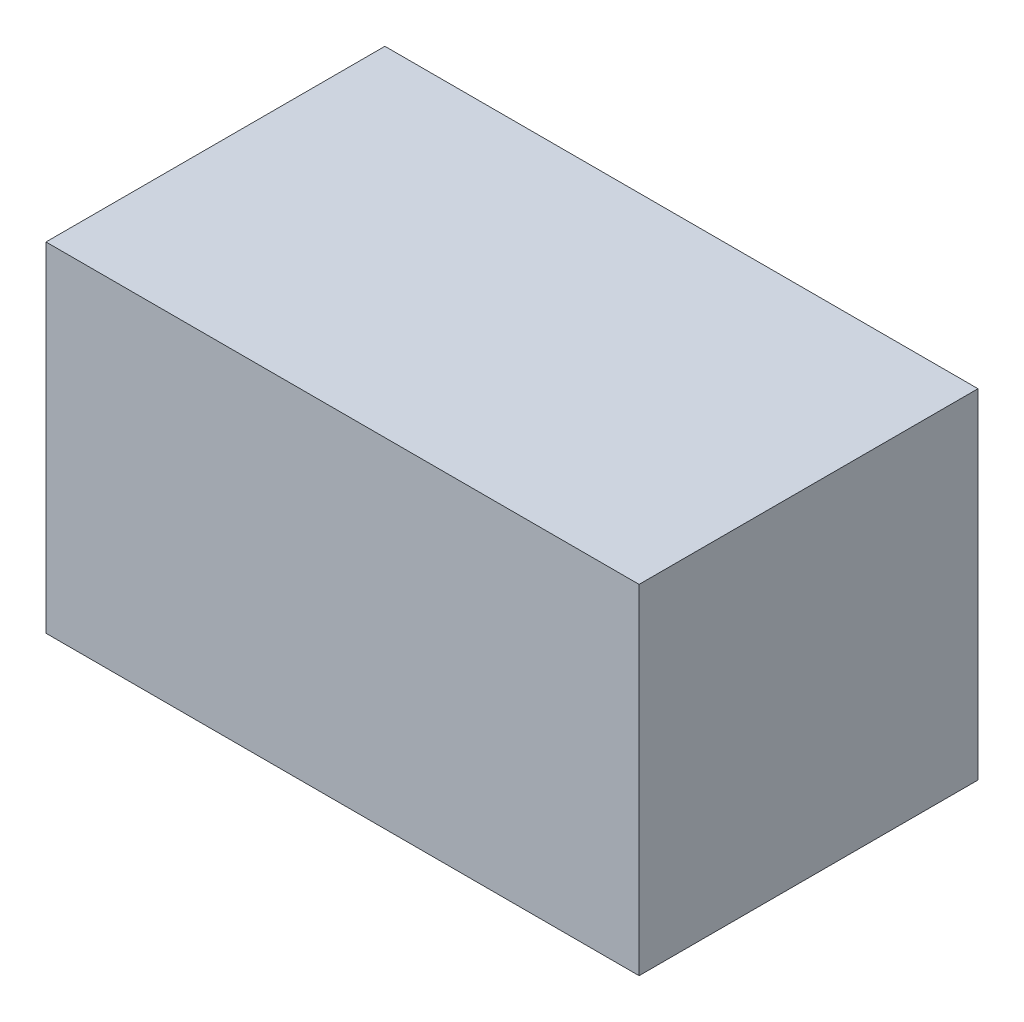
ISO-10303-21;
HEADER;
FILE_DESCRIPTION(('STEP AP214'),'2;1');
FILE_NAME('part.step','',(''),(''),'','','');
FILE_SCHEMA(('AUTOMOTIVE_DESIGN { 1 0 10303 214 1 1 1 1 }'));
ENDSEC;
DATA;
#1=APPLICATION_CONTEXT('core data for automotive mechanical design processes');
#2=APPLICATION_PROTOCOL_DEFINITION('international standard','automotive_design',2000,#1);
#3=PRODUCT_CONTEXT('',#1,'mechanical');
#4=PRODUCT('Part','Part','',(#3));
#5=PRODUCT_RELATED_PRODUCT_CATEGORY('part','',(#4));
#6=PRODUCT_DEFINITION_FORMATION('','',#4);
#7=PRODUCT_DEFINITION_CONTEXT('part definition',#1,'design');
#8=PRODUCT_DEFINITION('design','',#6,#7);
#9=PRODUCT_DEFINITION_SHAPE('','',#8);
#10=(LENGTH_UNIT() NAMED_UNIT(*) SI_UNIT(.MILLI.,.METRE.));
#11=(NAMED_UNIT(*) PLANE_ANGLE_UNIT() SI_UNIT($,.RADIAN.));
#12=(NAMED_UNIT(*) SI_UNIT($,.STERADIAN.) SOLID_ANGLE_UNIT());
#13=UNCERTAINTY_MEASURE_WITH_UNIT(LENGTH_MEASURE(1.E-05),#10,'distance_accuracy_value','');
#14=(GEOMETRIC_REPRESENTATION_CONTEXT(3) GLOBAL_UNCERTAINTY_ASSIGNED_CONTEXT((#13)) GLOBAL_UNIT_ASSIGNED_CONTEXT((#10,
#11,#12)) REPRESENTATION_CONTEXT('',''));
#15=CARTESIAN_POINT('',(0.,0.,0.));
#16=DIRECTION('',(0.,0.,1.));
#17=DIRECTION('',(1.,0.,0.));
#18=AXIS2_PLACEMENT_3D('',#15,#16,#17);
#19=CARTESIAN_POINT('',(44.45,50.8,25.4));
#20=DIRECTION('',(-1.,0.,0.));
#21=DIRECTION('',(0.,0.,1.));
#22=AXIS2_PLACEMENT_3D('',#19,#20,#21);
#23=PLANE('',#22);
#24=DIRECTION('',(0.,0.,-1.));
#25=VECTOR('',#24,1.);
#26=CARTESIAN_POINT('',(44.45,0.,25.4));
#27=LINE('',#26,#25);
#28=CARTESIAN_POINT('',(44.45,0.,25.4));
#29=VERTEX_POINT('',#28);
#30=CARTESIAN_POINT('',(44.45,0.,-25.4));
#31=VERTEX_POINT('',#30);
#32=EDGE_CURVE('E113',#29,#31,#27,.T.);
#33=ORIENTED_EDGE('',*,*,#32,.T.);
#34=DIRECTION('',(0.,-1.,0.));
#35=VECTOR('',#34,1.);
#36=CARTESIAN_POINT('',(44.45,50.8,-25.4));
#37=LINE('',#36,#35);
#38=CARTESIAN_POINT('',(44.45,50.8,-25.4));
#39=VERTEX_POINT('',#38);
#40=EDGE_CURVE('E11',#39,#31,#37,.T.);
#41=ORIENTED_EDGE('',*,*,#40,.F.);
#42=DIRECTION('',(0.,0.,-1.));
#43=VECTOR('',#42,1.);
#44=CARTESIAN_POINT('',(44.45,50.8,25.4));
#45=LINE('',#44,#43);
#46=CARTESIAN_POINT('',(44.45,50.8,25.4));
#47=VERTEX_POINT('',#46);
#48=EDGE_CURVE('E97',#47,#39,#45,.T.);
#49=ORIENTED_EDGE('',*,*,#48,.F.);
#50=DIRECTION('',(0.,-1.,0.));
#51=VECTOR('',#50,1.);
#52=CARTESIAN_POINT('',(44.45,50.8,25.4));
#53=LINE('',#52,#51);
#54=EDGE_CURVE('E109',#47,#29,#53,.T.);
#55=ORIENTED_EDGE('',*,*,#54,.T.);
#56=EDGE_LOOP('',(#33,#41,#49,#55));
#57=FACE_BOUND('',#56,.T.);
#58=ADVANCED_FACE('F45',(#57),#23,.F.);
#59=CARTESIAN_POINT('',(-44.45,50.8,-25.4));
#60=DIRECTION('',(0.,0.,1.));
#61=DIRECTION('',(1.,0.,0.));
#62=AXIS2_PLACEMENT_3D('',#59,#60,#61);
#63=PLANE('',#62);
#64=DIRECTION('',(-1.,0.,0.));
#65=VECTOR('',#64,1.);
#66=CARTESIAN_POINT('',(-44.45,0.,-25.4));
#67=LINE('',#66,#65);
#68=CARTESIAN_POINT('',(-44.45,0.,-25.4));
#69=VERTEX_POINT('',#68);
#70=EDGE_CURVE('E102',#31,#69,#67,.T.);
#71=ORIENTED_EDGE('',*,*,#70,.T.);
#72=DIRECTION('',(0.,-1.,0.));
#73=VECTOR('',#72,1.);
#74=CARTESIAN_POINT('',(-44.45,50.8,-25.4));
#75=LINE('',#74,#73);
#76=CARTESIAN_POINT('',(-44.45,50.8,-25.4));
#77=VERTEX_POINT('',#76);
#78=EDGE_CURVE('E54',#77,#69,#75,.T.);
#79=ORIENTED_EDGE('',*,*,#78,.F.);
#80=DIRECTION('',(-1.,0.,0.));
#81=VECTOR('',#80,1.);
#82=CARTESIAN_POINT('',(-44.45,50.8,-25.4));
#83=LINE('',#82,#81);
#84=EDGE_CURVE('E92',#39,#77,#83,.T.);
#85=ORIENTED_EDGE('',*,*,#84,.F.);
#86=ORIENTED_EDGE('',*,*,#40,.T.);
#87=EDGE_LOOP('',(#71,#79,#85,#86));
#88=FACE_BOUND('',#87,.T.);
#89=ADVANCED_FACE('F101',(#88),#63,.F.);
#90=CARTESIAN_POINT('',(-44.45,50.8,25.4));
#91=DIRECTION('',(1.,0.,0.));
#92=DIRECTION('',(0.,0.,-1.));
#93=AXIS2_PLACEMENT_3D('',#90,#91,#92);
#94=PLANE('',#93);
#95=DIRECTION('',(0.,0.,1.));
#96=VECTOR('',#95,1.);
#97=CARTESIAN_POINT('',(-44.45,0.,25.4));
#98=LINE('',#97,#96);
#99=CARTESIAN_POINT('',(-44.45,0.,25.4));
#100=VERTEX_POINT('',#99);
#101=EDGE_CURVE('E79',#69,#100,#98,.T.);
#102=ORIENTED_EDGE('',*,*,#101,.T.);
#103=DIRECTION('',(0.,-1.,0.));
#104=VECTOR('',#103,1.);
#105=CARTESIAN_POINT('',(-44.45,50.8,25.4));
#106=LINE('',#105,#104);
#107=CARTESIAN_POINT('',(-44.45,50.8,25.4));
#108=VERTEX_POINT('',#107);
#109=EDGE_CURVE('E104',#108,#100,#106,.T.);
#110=ORIENTED_EDGE('',*,*,#109,.F.);
#111=DIRECTION('',(0.,0.,1.));
#112=VECTOR('',#111,1.);
#113=CARTESIAN_POINT('',(-44.45,50.8,25.4));
#114=LINE('',#113,#112);
#115=EDGE_CURVE('E95',#77,#108,#114,.T.);
#116=ORIENTED_EDGE('',*,*,#115,.F.);
#117=ORIENTED_EDGE('',*,*,#78,.T.);
#118=EDGE_LOOP('',(#102,#110,#116,#117));
#119=FACE_BOUND('',#118,.T.);
#120=ADVANCED_FACE('F105',(#119),#94,.F.);
#121=CARTESIAN_POINT('',(-44.45,50.8,25.4));
#122=DIRECTION('',(0.,0.,-1.));
#123=DIRECTION('',(-1.,0.,0.));
#124=AXIS2_PLACEMENT_3D('',#121,#122,#123);
#125=PLANE('',#124);
#126=DIRECTION('',(1.,0.,0.));
#127=VECTOR('',#126,1.);
#128=CARTESIAN_POINT('',(-44.45,0.,25.4));
#129=LINE('',#128,#127);
#130=EDGE_CURVE('E85',#100,#29,#129,.T.);
#131=ORIENTED_EDGE('',*,*,#130,.T.);
#132=ORIENTED_EDGE('',*,*,#54,.F.);
#133=DIRECTION('',(1.,0.,0.));
#134=VECTOR('',#133,1.);
#135=CARTESIAN_POINT('',(-44.45,50.8,25.4));
#136=LINE('',#135,#134);
#137=EDGE_CURVE('E62',#108,#47,#136,.T.);
#138=ORIENTED_EDGE('',*,*,#137,.F.);
#139=ORIENTED_EDGE('',*,*,#109,.T.);
#140=EDGE_LOOP('',(#131,#132,#138,#139));
#141=FACE_BOUND('',#140,.T.);
#142=ADVANCED_FACE('F126',(#141),#125,.F.);
#143=CARTESIAN_POINT('',(0.,50.8,0.));
#144=DIRECTION('',(0.,-1.,0.));
#145=DIRECTION('',(0.,0.,-1.));
#146=AXIS2_PLACEMENT_3D('',#143,#144,#145);
#147=PLANE('',#146);
#148=ORIENTED_EDGE('',*,*,#48,.T.);
#149=ORIENTED_EDGE('',*,*,#84,.T.);
#150=ORIENTED_EDGE('',*,*,#115,.T.);
#151=ORIENTED_EDGE('',*,*,#137,.T.);
#152=EDGE_LOOP('',(#148,#149,#150,#151));
#153=FACE_BOUND('',#152,.T.);
#154=ADVANCED_FACE('F93',(#153),#147,.F.);
#155=CARTESIAN_POINT('',(0.,0.,0.));
#156=DIRECTION('',(0.,-1.,0.));
#157=DIRECTION('',(0.,0.,-1.));
#158=AXIS2_PLACEMENT_3D('',#155,#156,#157);
#159=PLANE('',#158);
#160=ORIENTED_EDGE('',*,*,#32,.F.);
#161=ORIENTED_EDGE('',*,*,#130,.F.);
#162=ORIENTED_EDGE('',*,*,#101,.F.);
#163=ORIENTED_EDGE('',*,*,#70,.F.);
#164=EDGE_LOOP('',(#160,#161,#162,#163));
#165=FACE_BOUND('',#164,.T.);
#166=ADVANCED_FACE('F129',(#165),#159,.T.);
#167=CLOSED_SHELL('',(#58,#89,#120,#142,#154,#166));
#168=MANIFOLD_SOLID_BREP('B2',#167);
#169=ADVANCED_BREP_SHAPE_REPRESENTATION('',(#18,#168),#14);
#170=SHAPE_DEFINITION_REPRESENTATION(#9,#169);
ENDSEC;
END-ISO-10303-21;
